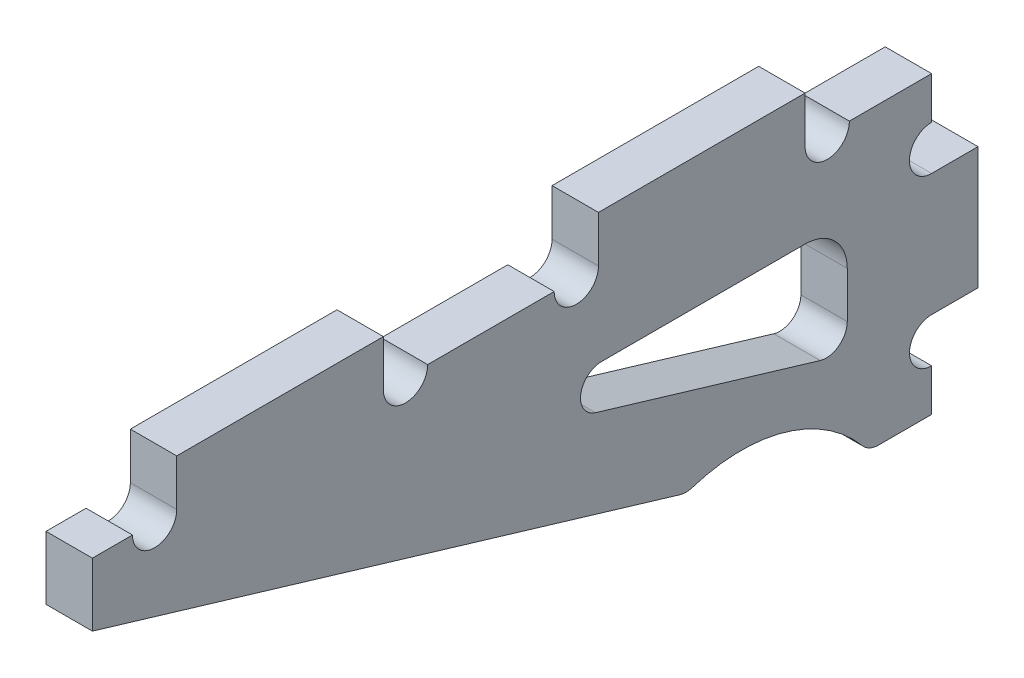
ISO-10303-21;
HEADER;
FILE_DESCRIPTION(('STEP AP214'),'2;1');
FILE_NAME('part.step','',(''),(''),'','','');
FILE_SCHEMA(('AUTOMOTIVE_DESIGN { 1 0 10303 214 1 1 1 1 }'));
ENDSEC;
DATA;
#1=APPLICATION_CONTEXT('core data for automotive mechanical design processes');
#2=APPLICATION_PROTOCOL_DEFINITION('international standard','automotive_design',2000,#1);
#3=PRODUCT_CONTEXT('',#1,'mechanical');
#4=PRODUCT('Part','Part','',(#3));
#5=PRODUCT_RELATED_PRODUCT_CATEGORY('part','',(#4));
#6=PRODUCT_DEFINITION_FORMATION('','',#4);
#7=PRODUCT_DEFINITION_CONTEXT('part definition',#1,'design');
#8=PRODUCT_DEFINITION('design','',#6,#7);
#9=PRODUCT_DEFINITION_SHAPE('','',#8);
#10=(LENGTH_UNIT() NAMED_UNIT(*) SI_UNIT(.MILLI.,.METRE.));
#11=(NAMED_UNIT(*) PLANE_ANGLE_UNIT() SI_UNIT($,.RADIAN.));
#12=(NAMED_UNIT(*) SI_UNIT($,.STERADIAN.) SOLID_ANGLE_UNIT());
#13=UNCERTAINTY_MEASURE_WITH_UNIT(LENGTH_MEASURE(1.E-05),#10,'distance_accuracy_value','');
#14=(GEOMETRIC_REPRESENTATION_CONTEXT(3) GLOBAL_UNCERTAINTY_ASSIGNED_CONTEXT((#13)) GLOBAL_UNIT_ASSIGNED_CONTEXT((#10,
#11,#12)) REPRESENTATION_CONTEXT('',''));
#15=CARTESIAN_POINT('',(0.,0.,0.));
#16=DIRECTION('',(0.,0.,1.));
#17=DIRECTION('',(1.,0.,0.));
#18=AXIS2_PLACEMENT_3D('',#15,#16,#17);
#19=CARTESIAN_POINT('',(2.2,0.,-6.9));
#20=DIRECTION('',(0.,0.,-1.));
#21=DIRECTION('',(-1.,0.,0.));
#22=AXIS2_PLACEMENT_3D('',#19,#20,#21);
#23=PLANE('',#22);
#24=DIRECTION('',(0.,-1.,0.));
#25=VECTOR('',#24,1.);
#26=CARTESIAN_POINT('',(0.,0.,-6.9));
#27=LINE('',#26,#25);
#28=CARTESIAN_POINT('',(0.,-7.1,-6.9));
#29=VERTEX_POINT('',#28);
#30=CARTESIAN_POINT('',(0.,-9.2835797355819,-6.9));
#31=VERTEX_POINT('',#30);
#32=EDGE_CURVE('E398',#29,#31,#27,.T.);
#33=ORIENTED_EDGE('',*,*,#32,.T.);
#34=DIRECTION('',(-1.,0.,0.));
#35=VECTOR('',#34,1.);
#36=CARTESIAN_POINT('',(2.2,-9.2835797355819,-6.9));
#37=LINE('',#36,#35);
#38=CARTESIAN_POINT('',(2.2,-9.2835797355819,-6.9));
#39=VERTEX_POINT('',#38);
#40=EDGE_CURVE('E481',#31,#39,#37,.F.);
#41=ORIENTED_EDGE('',*,*,#40,.T.);
#42=DIRECTION('',(0.,-1.,0.));
#43=VECTOR('',#42,1.);
#44=CARTESIAN_POINT('',(2.2,0.,-6.9));
#45=LINE('',#44,#43);
#46=CARTESIAN_POINT('',(2.2,-7.1,-6.9));
#47=VERTEX_POINT('',#46);
#48=EDGE_CURVE('E328',#47,#39,#45,.T.);
#49=ORIENTED_EDGE('',*,*,#48,.F.);
#50=DIRECTION('',(-1.,0.,0.));
#51=VECTOR('',#50,1.);
#52=CARTESIAN_POINT('',(0.,-7.1,-6.9));
#53=LINE('',#52,#51);
#54=EDGE_CURVE('E268',#47,#29,#53,.T.);
#55=ORIENTED_EDGE('',*,*,#54,.T.);
#56=EDGE_LOOP('',(#33,#41,#49,#55));
#57=FACE_BOUND('',#56,.T.);
#58=ADVANCED_FACE('F36',(#57),#23,.F.);
#59=CARTESIAN_POINT('',(2.2,-7.86131125572215,2.34984847317782));
#60=DIRECTION('',(0.,-0.958112439858677,0.286392305392539));
#61=DIRECTION('',(0.,-0.286392305392539,-0.958112439858677));
#62=AXIS2_PLACEMENT_3D('',#59,#60,#61);
#63=PLANE('',#62);
#64=DIRECTION('',(0.,0.286392305392539,0.958112439858677));
#65=VECTOR('',#64,1.);
#66=CARTESIAN_POINT('',(2.2,-7.86131125572215,2.34984847317782));
#67=LINE('',#66,#65);
#68=CARTESIAN_POINT('',(2.2,-10.2416921754406,-5.61360769460746));
#69=VERTEX_POINT('',#68);
#70=CARTESIAN_POINT('',(2.2,-7.05811243985868,5.03691360261197));
#71=VERTEX_POINT('',#70);
#72=EDGE_CURVE('E330',#69,#71,#67,.T.);
#73=ORIENTED_EDGE('',*,*,#72,.F.);
#74=DIRECTION('',(-1.,0.,0.));
#75=VECTOR('',#74,1.);
#76=CARTESIAN_POINT('',(0.,-10.2416921754406,-5.61360769460746));
#77=LINE('',#76,#75);
#78=CARTESIAN_POINT('',(0.,-10.2416921754406,-5.61360769460746));
#79=VERTEX_POINT('',#78);
#80=EDGE_CURVE('E478',#69,#79,#77,.T.);
#81=ORIENTED_EDGE('',*,*,#80,.T.);
#82=DIRECTION('',(0.,0.286392305392539,0.958112439858677));
#83=VECTOR('',#82,1.);
#84=CARTESIAN_POINT('',(0.,-7.86131125572215,2.34984847317782));
#85=LINE('',#84,#83);
#86=CARTESIAN_POINT('',(0.,-7.05811243985868,5.03691360261197));
#87=VERTEX_POINT('',#86);
#88=EDGE_CURVE('E401',#79,#87,#85,.T.);
#89=ORIENTED_EDGE('',*,*,#88,.T.);
#90=DIRECTION('',(-1.,0.,0.));
#91=VECTOR('',#90,1.);
#92=CARTESIAN_POINT('',(2.2,-7.05811243985868,5.03691360261197));
#93=LINE('',#92,#91);
#94=EDGE_CURVE('E51',#87,#71,#93,.F.);
#95=ORIENTED_EDGE('',*,*,#94,.T.);
#96=EDGE_LOOP('',(#73,#81,#89,#95));
#97=FACE_BOUND('',#96,.T.);
#98=ADVANCED_FACE('F495',(#97),#63,.F.);
#99=CARTESIAN_POINT('',(2.2,-19.5599092648856,-1.87014018828072));
#100=DIRECTION('',(-1.,0.,0.));
#101=DIRECTION('',(0.,0.,1.));
#102=AXIS2_PLACEMENT_3D('',#99,#100,#101);
#103=CYLINDRICAL_SURFACE('',#102,7.50000000000001);
#104=CARTESIAN_POINT('',(0.,-19.5599092648856,-1.87014018828072));
#105=DIRECTION('',(1.,0.,0.));
#106=DIRECTION('',(0.,0.,-1.));
#107=AXIS2_PLACEMENT_3D('',#104,#105,#106);
#108=CIRCLE('',#107,7.50000000000001);
#109=CARTESIAN_POINT('',(0.,-14.7423422664571,-7.61827451305538));
#110=VERTEX_POINT('',#109);
#111=CARTESIAN_POINT('',(0.,-12.4236850596521,0.43730517242417));
#112=VERTEX_POINT('',#111);
#113=EDGE_CURVE('E335',#110,#112,#108,.T.);
#114=ORIENTED_EDGE('',*,*,#113,.F.);
#115=DIRECTION('',(-1.,0.,0.));
#116=VECTOR('',#115,1.);
#117=CARTESIAN_POINT('',(2.2,-14.7423422664571,-7.61827451305539));
#118=LINE('',#117,#116);
#119=CARTESIAN_POINT('',(2.2,-14.7423422664571,-7.61827451305538));
#120=VERTEX_POINT('',#119);
#121=EDGE_CURVE('E470',#110,#120,#118,.F.);
#122=ORIENTED_EDGE('',*,*,#121,.T.);
#123=CARTESIAN_POINT('',(2.2,-19.5599092648856,-1.87014018828072));
#124=DIRECTION('',(1.,0.,0.));
#125=DIRECTION('',(0.,0.,-1.));
#126=AXIS2_PLACEMENT_3D('',#123,#124,#125);
#127=CIRCLE('',#126,7.50000000000001);
#128=CARTESIAN_POINT('',(2.2,-12.4236850596521,0.43730517242417));
#129=VERTEX_POINT('',#128);
#130=EDGE_CURVE('E258',#120,#129,#127,.T.);
#131=ORIENTED_EDGE('',*,*,#130,.T.);
#132=DIRECTION('',(-1.,0.,0.));
#133=VECTOR('',#132,1.);
#134=CARTESIAN_POINT('',(2.2,-12.4236850596521,0.437305172424171));
#135=LINE('',#134,#133);
#136=EDGE_CURVE('E467',#129,#112,#135,.T.);
#137=ORIENTED_EDGE('',*,*,#136,.T.);
#138=EDGE_LOOP('',(#114,#122,#131,#137));
#139=FACE_BOUND('',#138,.T.);
#140=ADVANCED_FACE('F525',(#139),#103,.F.);
#141=CARTESIAN_POINT('',(2.2,-15.1,0.));
#142=DIRECTION('',(0.,1.,0.));
#143=DIRECTION('',(0.,0.,1.));
#144=AXIS2_PLACEMENT_3D('',#141,#142,#143);
#145=PLANE('',#144);
#146=DIRECTION('',(0.,0.,-1.));
#147=VECTOR('',#146,1.);
#148=CARTESIAN_POINT('',(2.2,-15.1,0.));
#149=LINE('',#148,#147);
#150=CARTESIAN_POINT('',(2.2,-15.1,-8.38469242302534));
#151=VERTEX_POINT('',#150);
#152=CARTESIAN_POINT('',(2.2,-15.1,-10.9));
#153=VERTEX_POINT('',#152);
#154=EDGE_CURVE('E245',#151,#153,#149,.T.);
#155=ORIENTED_EDGE('',*,*,#154,.F.);
#156=DIRECTION('',(1.,0.,0.));
#157=VECTOR('',#156,1.);
#158=CARTESIAN_POINT('',(0.,-15.1,-8.38469242302534));
#159=LINE('',#158,#157);
#160=CARTESIAN_POINT('',(0.,-15.1,-8.38469242302534));
#161=VERTEX_POINT('',#160);
#162=EDGE_CURVE('E461',#151,#161,#159,.F.);
#163=ORIENTED_EDGE('',*,*,#162,.T.);
#164=DIRECTION('',(0.,0.,-1.));
#165=VECTOR('',#164,1.);
#166=CARTESIAN_POINT('',(0.,-15.1,0.));
#167=LINE('',#166,#165);
#168=CARTESIAN_POINT('',(0.,-15.1,-10.9));
#169=VERTEX_POINT('',#168);
#170=EDGE_CURVE('E264',#161,#169,#167,.T.);
#171=ORIENTED_EDGE('',*,*,#170,.T.);
#172=DIRECTION('',(-1.,0.,0.));
#173=VECTOR('',#172,1.);
#174=CARTESIAN_POINT('',(2.2,-15.1,-10.9));
#175=LINE('',#174,#173);
#176=EDGE_CURVE('E261',#153,#169,#175,.T.);
#177=ORIENTED_EDGE('',*,*,#176,.F.);
#178=EDGE_LOOP('',(#155,#163,#171,#177));
#179=FACE_BOUND('',#178,.T.);
#180=ADVANCED_FACE('F262',(#179),#145,.F.);
#181=CARTESIAN_POINT('',(2.2,0.,-10.9));
#182=DIRECTION('',(0.,0.,1.));
#183=DIRECTION('',(1.,0.,0.));
#184=AXIS2_PLACEMENT_3D('',#181,#182,#183);
#185=PLANE('',#184);
#186=DIRECTION('',(0.,1.,0.));
#187=VECTOR('',#186,1.);
#188=CARTESIAN_POINT('',(0.,0.,-10.9));
#189=LINE('',#188,#187);
#190=CARTESIAN_POINT('',(0.,-13.1,-10.9));
#191=VERTEX_POINT('',#190);
#192=EDGE_CURVE('E339',#169,#191,#189,.T.);
#193=ORIENTED_EDGE('',*,*,#192,.T.);
#194=DIRECTION('',(-1.,0.,0.));
#195=VECTOR('',#194,1.);
#196=CARTESIAN_POINT('',(2.2,-13.1,-10.9));
#197=LINE('',#196,#195);
#198=CARTESIAN_POINT('',(2.2,-13.1,-10.9));
#199=VERTEX_POINT('',#198);
#200=EDGE_CURVE('E269',#199,#191,#197,.T.);
#201=ORIENTED_EDGE('',*,*,#200,.F.);
#202=DIRECTION('',(0.,1.,0.));
#203=VECTOR('',#202,1.);
#204=CARTESIAN_POINT('',(2.2,0.,-10.9));
#205=LINE('',#204,#203);
#206=EDGE_CURVE('E251',#153,#199,#205,.T.);
#207=ORIENTED_EDGE('',*,*,#206,.F.);
#208=ORIENTED_EDGE('',*,*,#176,.T.);
#209=EDGE_LOOP('',(#193,#201,#207,#208));
#210=FACE_BOUND('',#209,.T.);
#211=ADVANCED_FACE('F271',(#210),#185,.F.);
#212=CARTESIAN_POINT('',(2.2,-12.05,-10.9));
#213=DIRECTION('',(-1.,0.,0.));
#214=DIRECTION('',(0.,0.,1.));
#215=AXIS2_PLACEMENT_3D('',#212,#213,#214);
#216=CYLINDRICAL_SURFACE('',#215,1.05);
#217=CARTESIAN_POINT('',(0.,-12.05,-10.9));
#218=DIRECTION('',(1.,0.,0.));
#219=DIRECTION('',(0.,0.,-1.));
#220=AXIS2_PLACEMENT_3D('',#217,#218,#219);
#221=CIRCLE('',#220,1.05);
#222=CARTESIAN_POINT('',(0.,-11.,-10.9));
#223=VERTEX_POINT('',#222);
#224=EDGE_CURVE('E341',#223,#191,#221,.T.);
#225=ORIENTED_EDGE('',*,*,#224,.F.);
#226=DIRECTION('',(-1.,0.,0.));
#227=VECTOR('',#226,1.);
#228=CARTESIAN_POINT('',(2.2,-11.,-10.9));
#229=LINE('',#228,#227);
#230=CARTESIAN_POINT('',(2.2,-11.,-10.9));
#231=VERTEX_POINT('',#230);
#232=EDGE_CURVE('E448',#231,#223,#229,.T.);
#233=ORIENTED_EDGE('',*,*,#232,.F.);
#234=CARTESIAN_POINT('',(2.2,-12.05,-10.9));
#235=DIRECTION('',(1.,0.,0.));
#236=DIRECTION('',(0.,0.,-1.));
#237=AXIS2_PLACEMENT_3D('',#234,#235,#236);
#238=CIRCLE('',#237,1.05);
#239=EDGE_CURVE('E273',#231,#199,#238,.T.);
#240=ORIENTED_EDGE('',*,*,#239,.T.);
#241=ORIENTED_EDGE('',*,*,#200,.T.);
#242=EDGE_LOOP('',(#225,#233,#240,#241));
#243=FACE_BOUND('',#242,.T.);
#244=ADVANCED_FACE('F608',(#243),#216,.F.);
#245=CARTESIAN_POINT('',(2.2,-11.,0.));
#246=DIRECTION('',(0.,-1.,0.));
#247=DIRECTION('',(0.,0.,-1.));
#248=AXIS2_PLACEMENT_3D('',#245,#246,#247);
#249=PLANE('',#248);
#250=DIRECTION('',(0.,0.,1.));
#251=VECTOR('',#250,1.);
#252=CARTESIAN_POINT('',(0.,-11.,0.));
#253=LINE('',#252,#251);
#254=CARTESIAN_POINT('',(0.,-11.,-13.1));
#255=VERTEX_POINT('',#254);
#256=EDGE_CURVE('E344',#255,#223,#253,.T.);
#257=ORIENTED_EDGE('',*,*,#256,.F.);
#258=DIRECTION('',(-1.,0.,0.));
#259=VECTOR('',#258,1.);
#260=CARTESIAN_POINT('',(2.2,-11.,-13.1));
#261=LINE('',#260,#259);
#262=CARTESIAN_POINT('',(2.2,-11.,-13.1));
#263=VERTEX_POINT('',#262);
#264=EDGE_CURVE('E446',#263,#255,#261,.T.);
#265=ORIENTED_EDGE('',*,*,#264,.F.);
#266=DIRECTION('',(0.,0.,1.));
#267=VECTOR('',#266,1.);
#268=CARTESIAN_POINT('',(2.2,-11.,0.));
#269=LINE('',#268,#267);
#270=EDGE_CURVE('E275',#263,#231,#269,.T.);
#271=ORIENTED_EDGE('',*,*,#270,.T.);
#272=ORIENTED_EDGE('',*,*,#232,.T.);
#273=EDGE_LOOP('',(#257,#265,#271,#272));
#274=FACE_BOUND('',#273,.T.);
#275=ADVANCED_FACE('F604',(#274),#249,.T.);
#276=CARTESIAN_POINT('',(2.2,0.,-13.1));
#277=DIRECTION('',(0.,0.,1.));
#278=DIRECTION('',(1.,0.,0.));
#279=AXIS2_PLACEMENT_3D('',#276,#277,#278);
#280=PLANE('',#279);
#281=DIRECTION('',(0.,1.,0.));
#282=VECTOR('',#281,1.);
#283=CARTESIAN_POINT('',(0.,0.,-13.1));
#284=LINE('',#283,#282);
#285=CARTESIAN_POINT('',(0.,-5.2,-13.1));
#286=VERTEX_POINT('',#285);
#287=EDGE_CURVE('E347',#255,#286,#284,.T.);
#288=ORIENTED_EDGE('',*,*,#287,.T.);
#289=DIRECTION('',(-1.,0.,0.));
#290=VECTOR('',#289,1.);
#291=CARTESIAN_POINT('',(2.2,-5.2,-13.1));
#292=LINE('',#291,#290);
#293=CARTESIAN_POINT('',(2.2,-5.2,-13.1));
#294=VERTEX_POINT('',#293);
#295=EDGE_CURVE('E443',#294,#286,#292,.T.);
#296=ORIENTED_EDGE('',*,*,#295,.F.);
#297=DIRECTION('',(0.,1.,0.));
#298=VECTOR('',#297,1.);
#299=CARTESIAN_POINT('',(2.2,0.,-13.1));
#300=LINE('',#299,#298);
#301=EDGE_CURVE('E281',#263,#294,#300,.T.);
#302=ORIENTED_EDGE('',*,*,#301,.F.);
#303=ORIENTED_EDGE('',*,*,#264,.T.);
#304=EDGE_LOOP('',(#288,#296,#302,#303));
#305=FACE_BOUND('',#304,.T.);
#306=ADVANCED_FACE('F600',(#305),#280,.F.);
#307=CARTESIAN_POINT('',(2.2,-5.2,0.));
#308=DIRECTION('',(0.,-1.,0.));
#309=DIRECTION('',(0.,0.,-1.));
#310=AXIS2_PLACEMENT_3D('',#307,#308,#309);
#311=PLANE('',#310);
#312=DIRECTION('',(0.,0.,1.));
#313=VECTOR('',#312,1.);
#314=CARTESIAN_POINT('',(0.,-5.2,0.));
#315=LINE('',#314,#313);
#316=CARTESIAN_POINT('',(0.,-5.2,-10.9));
#317=VERTEX_POINT('',#316);
#318=EDGE_CURVE('E349',#286,#317,#315,.T.);
#319=ORIENTED_EDGE('',*,*,#318,.T.);
#320=DIRECTION('',(-1.,0.,0.));
#321=VECTOR('',#320,1.);
#322=CARTESIAN_POINT('',(2.2,-5.2,-10.9));
#323=LINE('',#322,#321);
#324=CARTESIAN_POINT('',(2.2,-5.2,-10.9));
#325=VERTEX_POINT('',#324);
#326=EDGE_CURVE('E441',#325,#317,#323,.T.);
#327=ORIENTED_EDGE('',*,*,#326,.F.);
#328=DIRECTION('',(0.,0.,1.));
#329=VECTOR('',#328,1.);
#330=CARTESIAN_POINT('',(2.2,-5.2,0.));
#331=LINE('',#330,#329);
#332=EDGE_CURVE('E283',#294,#325,#331,.T.);
#333=ORIENTED_EDGE('',*,*,#332,.F.);
#334=ORIENTED_EDGE('',*,*,#295,.T.);
#335=EDGE_LOOP('',(#319,#327,#333,#334));
#336=FACE_BOUND('',#335,.T.);
#337=ADVANCED_FACE('F596',(#336),#311,.F.);
#338=CARTESIAN_POINT('',(2.2,-4.15,-10.9));
#339=DIRECTION('',(-1.,0.,0.));
#340=DIRECTION('',(0.,0.,1.));
#341=AXIS2_PLACEMENT_3D('',#338,#339,#340);
#342=CYLINDRICAL_SURFACE('',#341,1.05);
#343=CARTESIAN_POINT('',(0.,-4.15,-10.9));
#344=DIRECTION('',(1.,0.,0.));
#345=DIRECTION('',(0.,0.,-1.));
#346=AXIS2_PLACEMENT_3D('',#343,#344,#345);
#347=CIRCLE('',#346,1.05);
#348=CARTESIAN_POINT('',(0.,-3.1,-10.9));
#349=VERTEX_POINT('',#348);
#350=EDGE_CURVE('E352',#349,#317,#347,.T.);
#351=ORIENTED_EDGE('',*,*,#350,.F.);
#352=DIRECTION('',(-1.,0.,0.));
#353=VECTOR('',#352,1.);
#354=CARTESIAN_POINT('',(2.2,-3.1,-10.9));
#355=LINE('',#354,#353);
#356=CARTESIAN_POINT('',(2.2,-3.1,-10.9));
#357=VERTEX_POINT('',#356);
#358=EDGE_CURVE('E439',#357,#349,#355,.T.);
#359=ORIENTED_EDGE('',*,*,#358,.F.);
#360=CARTESIAN_POINT('',(2.2,-4.15,-10.9));
#361=DIRECTION('',(1.,0.,0.));
#362=DIRECTION('',(0.,0.,-1.));
#363=AXIS2_PLACEMENT_3D('',#360,#361,#362);
#364=CIRCLE('',#363,1.05);
#365=EDGE_CURVE('E285',#357,#325,#364,.T.);
#366=ORIENTED_EDGE('',*,*,#365,.T.);
#367=ORIENTED_EDGE('',*,*,#326,.T.);
#368=EDGE_LOOP('',(#351,#359,#366,#367));
#369=FACE_BOUND('',#368,.T.);
#370=ADVANCED_FACE('F592',(#369),#342,.F.);
#371=CARTESIAN_POINT('',(2.2,0.,-10.9));
#372=DIRECTION('',(0.,0.,-1.));
#373=DIRECTION('',(-1.,0.,0.));
#374=AXIS2_PLACEMENT_3D('',#371,#372,#373);
#375=PLANE('',#374);
#376=DIRECTION('',(0.,-1.,0.));
#377=VECTOR('',#376,1.);
#378=CARTESIAN_POINT('',(0.,0.,-10.9));
#379=LINE('',#378,#377);
#380=CARTESIAN_POINT('',(0.,-1.1,-10.9));
#381=VERTEX_POINT('',#380);
#382=EDGE_CURVE('E355',#381,#349,#379,.T.);
#383=ORIENTED_EDGE('',*,*,#382,.F.);
#384=DIRECTION('',(-1.,0.,0.));
#385=VECTOR('',#384,1.);
#386=CARTESIAN_POINT('',(2.2,-1.1,-10.9));
#387=LINE('',#386,#385);
#388=CARTESIAN_POINT('',(2.2,-1.1,-10.9));
#389=VERTEX_POINT('',#388);
#390=EDGE_CURVE('E437',#389,#381,#387,.T.);
#391=ORIENTED_EDGE('',*,*,#390,.F.);
#392=DIRECTION('',(0.,-1.,0.));
#393=VECTOR('',#392,1.);
#394=CARTESIAN_POINT('',(2.2,0.,-10.9));
#395=LINE('',#394,#393);
#396=EDGE_CURVE('E288',#389,#357,#395,.T.);
#397=ORIENTED_EDGE('',*,*,#396,.T.);
#398=ORIENTED_EDGE('',*,*,#358,.T.);
#399=EDGE_LOOP('',(#383,#391,#397,#398));
#400=FACE_BOUND('',#399,.T.);
#401=ADVANCED_FACE('F588',(#400),#375,.T.);
#402=CARTESIAN_POINT('',(2.2,-1.1,0.));
#403=DIRECTION('',(0.,1.,0.));
#404=DIRECTION('',(0.,0.,1.));
#405=AXIS2_PLACEMENT_3D('',#402,#403,#404);
#406=PLANE('',#405);
#407=DIRECTION('',(0.,0.,-1.));
#408=VECTOR('',#407,1.);
#409=CARTESIAN_POINT('',(0.,-1.1,0.));
#410=LINE('',#409,#408);
#411=CARTESIAN_POINT('',(0.,-1.1,-7.));
#412=VERTEX_POINT('',#411);
#413=EDGE_CURVE('E358',#412,#381,#410,.T.);
#414=ORIENTED_EDGE('',*,*,#413,.F.);
#415=DIRECTION('',(-1.,0.,0.));
#416=VECTOR('',#415,1.);
#417=CARTESIAN_POINT('',(2.2,-1.1,-7.));
#418=LINE('',#417,#416);
#419=CARTESIAN_POINT('',(2.2,-1.1,-7.));
#420=VERTEX_POINT('',#419);
#421=EDGE_CURVE('E435',#420,#412,#418,.T.);
#422=ORIENTED_EDGE('',*,*,#421,.F.);
#423=DIRECTION('',(0.,0.,-1.));
#424=VECTOR('',#423,1.);
#425=CARTESIAN_POINT('',(2.2,-1.1,0.));
#426=LINE('',#425,#424);
#427=EDGE_CURVE('E291',#420,#389,#426,.T.);
#428=ORIENTED_EDGE('',*,*,#427,.T.);
#429=ORIENTED_EDGE('',*,*,#390,.T.);
#430=EDGE_LOOP('',(#414,#422,#428,#429));
#431=FACE_BOUND('',#430,.T.);
#432=ADVANCED_FACE('F584',(#431),#406,.T.);
#433=CARTESIAN_POINT('',(2.2,-1.1,-5.95));
#434=DIRECTION('',(-1.,0.,0.));
#435=DIRECTION('',(0.,0.,1.));
#436=AXIS2_PLACEMENT_3D('',#433,#434,#435);
#437=CYLINDRICAL_SURFACE('',#436,1.05);
#438=CARTESIAN_POINT('',(0.,-1.1,-5.95));
#439=DIRECTION('',(1.,0.,0.));
#440=DIRECTION('',(0.,0.,-1.));
#441=AXIS2_PLACEMENT_3D('',#438,#439,#440);
#442=CIRCLE('',#441,1.05);
#443=CARTESIAN_POINT('',(0.,-1.1,-4.9));
#444=VERTEX_POINT('',#443);
#445=EDGE_CURVE('E361',#444,#412,#442,.T.);
#446=ORIENTED_EDGE('',*,*,#445,.F.);
#447=DIRECTION('',(-1.,0.,0.));
#448=VECTOR('',#447,1.);
#449=CARTESIAN_POINT('',(2.2,-1.1,-4.9));
#450=LINE('',#449,#448);
#451=CARTESIAN_POINT('',(2.2,-1.1,-4.9));
#452=VERTEX_POINT('',#451);
#453=EDGE_CURVE('E433',#452,#444,#450,.T.);
#454=ORIENTED_EDGE('',*,*,#453,.F.);
#455=CARTESIAN_POINT('',(2.2,-1.1,-5.95));
#456=DIRECTION('',(1.,0.,0.));
#457=DIRECTION('',(0.,0.,-1.));
#458=AXIS2_PLACEMENT_3D('',#455,#456,#457);
#459=CIRCLE('',#458,1.05);
#460=EDGE_CURVE('E294',#452,#420,#459,.T.);
#461=ORIENTED_EDGE('',*,*,#460,.T.);
#462=ORIENTED_EDGE('',*,*,#421,.T.);
#463=EDGE_LOOP('',(#446,#454,#461,#462));
#464=FACE_BOUND('',#463,.T.);
#465=ADVANCED_FACE('F580',(#464),#437,.F.);
#466=CARTESIAN_POINT('',(2.2,0.,-4.9));
#467=DIRECTION('',(0.,0.,1.));
#468=DIRECTION('',(1.,0.,0.));
#469=AXIS2_PLACEMENT_3D('',#466,#467,#468);
#470=PLANE('',#469);
#471=DIRECTION('',(0.,1.,0.));
#472=VECTOR('',#471,1.);
#473=CARTESIAN_POINT('',(0.,0.,-4.9));
#474=LINE('',#473,#472);
#475=CARTESIAN_POINT('',(0.,1.1,-4.9));
#476=VERTEX_POINT('',#475);
#477=EDGE_CURVE('E364',#444,#476,#474,.T.);
#478=ORIENTED_EDGE('',*,*,#477,.T.);
#479=DIRECTION('',(-1.,0.,0.));
#480=VECTOR('',#479,1.);
#481=CARTESIAN_POINT('',(2.2,1.1,-4.9));
#482=LINE('',#481,#480);
#483=CARTESIAN_POINT('',(2.2,1.1,-4.9));
#484=VERTEX_POINT('',#483);
#485=EDGE_CURVE('E430',#484,#476,#482,.T.);
#486=ORIENTED_EDGE('',*,*,#485,.F.);
#487=DIRECTION('',(0.,1.,0.));
#488=VECTOR('',#487,1.);
#489=CARTESIAN_POINT('',(2.2,0.,-4.9));
#490=LINE('',#489,#488);
#491=EDGE_CURVE('E297',#452,#484,#490,.T.);
#492=ORIENTED_EDGE('',*,*,#491,.F.);
#493=ORIENTED_EDGE('',*,*,#453,.T.);
#494=EDGE_LOOP('',(#478,#486,#492,#493));
#495=FACE_BOUND('',#494,.T.);
#496=ADVANCED_FACE('F576',(#495),#470,.F.);
#497=CARTESIAN_POINT('',(2.2,1.1,0.));
#498=DIRECTION('',(0.,-1.,0.));
#499=DIRECTION('',(0.,0.,-1.));
#500=AXIS2_PLACEMENT_3D('',#497,#498,#499);
#501=PLANE('',#500);
#502=DIRECTION('',(0.,0.,1.));
#503=VECTOR('',#502,1.);
#504=CARTESIAN_POINT('',(0.,1.1,0.));
#505=LINE('',#504,#503);
#506=CARTESIAN_POINT('',(0.,1.1,4.9));
#507=VERTEX_POINT('',#506);
#508=EDGE_CURVE('E366',#476,#507,#505,.T.);
#509=ORIENTED_EDGE('',*,*,#508,.T.);
#510=DIRECTION('',(-1.,0.,0.));
#511=VECTOR('',#510,1.);
#512=CARTESIAN_POINT('',(2.2,1.1,4.9));
#513=LINE('',#512,#511);
#514=CARTESIAN_POINT('',(2.2,1.1,4.9));
#515=VERTEX_POINT('',#514);
#516=EDGE_CURVE('E428',#515,#507,#513,.T.);
#517=ORIENTED_EDGE('',*,*,#516,.F.);
#518=DIRECTION('',(0.,0.,1.));
#519=VECTOR('',#518,1.);
#520=CARTESIAN_POINT('',(2.2,1.1,0.));
#521=LINE('',#520,#519);
#522=EDGE_CURVE('E299',#484,#515,#521,.T.);
#523=ORIENTED_EDGE('',*,*,#522,.F.);
#524=ORIENTED_EDGE('',*,*,#485,.T.);
#525=EDGE_LOOP('',(#509,#517,#523,#524));
#526=FACE_BOUND('',#525,.T.);
#527=ADVANCED_FACE('F572',(#526),#501,.F.);
#528=CARTESIAN_POINT('',(2.2,0.,4.9));
#529=DIRECTION('',(0.,0.,1.));
#530=DIRECTION('',(1.,0.,0.));
#531=AXIS2_PLACEMENT_3D('',#528,#529,#530);
#532=PLANE('',#531);
#533=DIRECTION('',(0.,1.,0.));
#534=VECTOR('',#533,1.);
#535=CARTESIAN_POINT('',(0.,0.,4.9));
#536=LINE('',#535,#534);
#537=CARTESIAN_POINT('',(0.,-1.1,4.9));
#538=VERTEX_POINT('',#537);
#539=EDGE_CURVE('E369',#538,#507,#536,.T.);
#540=ORIENTED_EDGE('',*,*,#539,.F.);
#541=DIRECTION('',(-1.,0.,0.));
#542=VECTOR('',#541,1.);
#543=CARTESIAN_POINT('',(2.2,-1.1,4.9));
#544=LINE('',#543,#542);
#545=CARTESIAN_POINT('',(2.2,-1.1,4.9));
#546=VERTEX_POINT('',#545);
#547=EDGE_CURVE('E426',#546,#538,#544,.T.);
#548=ORIENTED_EDGE('',*,*,#547,.F.);
#549=DIRECTION('',(0.,1.,0.));
#550=VECTOR('',#549,1.);
#551=CARTESIAN_POINT('',(2.2,0.,4.9));
#552=LINE('',#551,#550);
#553=EDGE_CURVE('E301',#546,#515,#552,.T.);
#554=ORIENTED_EDGE('',*,*,#553,.T.);
#555=ORIENTED_EDGE('',*,*,#516,.T.);
#556=EDGE_LOOP('',(#540,#548,#554,#555));
#557=FACE_BOUND('',#556,.T.);
#558=ADVANCED_FACE('F568',(#557),#532,.T.);
#559=CARTESIAN_POINT('',(2.2,-1.1,5.95));
#560=DIRECTION('',(-1.,0.,0.));
#561=DIRECTION('',(0.,0.,1.));
#562=AXIS2_PLACEMENT_3D('',#559,#560,#561);
#563=CYLINDRICAL_SURFACE('',#562,1.05);
#564=CARTESIAN_POINT('',(0.,-1.1,5.95));
#565=DIRECTION('',(1.,0.,0.));
#566=DIRECTION('',(0.,0.,-1.));
#567=AXIS2_PLACEMENT_3D('',#564,#565,#566);
#568=CIRCLE('',#567,1.05);
#569=CARTESIAN_POINT('',(0.,-1.1,7.));
#570=VERTEX_POINT('',#569);
#571=EDGE_CURVE('E372',#570,#538,#568,.T.);
#572=ORIENTED_EDGE('',*,*,#571,.F.);
#573=DIRECTION('',(-1.,0.,0.));
#574=VECTOR('',#573,1.);
#575=CARTESIAN_POINT('',(2.2,-1.1,7.));
#576=LINE('',#575,#574);
#577=CARTESIAN_POINT('',(2.2,-1.1,7.));
#578=VERTEX_POINT('',#577);
#579=EDGE_CURVE('E424',#578,#570,#576,.T.);
#580=ORIENTED_EDGE('',*,*,#579,.F.);
#581=CARTESIAN_POINT('',(2.2,-1.1,5.95));
#582=DIRECTION('',(1.,0.,0.));
#583=DIRECTION('',(0.,0.,-1.));
#584=AXIS2_PLACEMENT_3D('',#581,#582,#583);
#585=CIRCLE('',#584,1.05);
#586=EDGE_CURVE('E304',#578,#546,#585,.T.);
#587=ORIENTED_EDGE('',*,*,#586,.T.);
#588=ORIENTED_EDGE('',*,*,#547,.T.);
#589=EDGE_LOOP('',(#572,#580,#587,#588));
#590=FACE_BOUND('',#589,.T.);
#591=ADVANCED_FACE('F564',(#590),#563,.F.);
#592=CARTESIAN_POINT('',(2.2,-1.1,0.));
#593=DIRECTION('',(0.,-1.,0.));
#594=DIRECTION('',(0.,0.,-1.));
#595=AXIS2_PLACEMENT_3D('',#592,#593,#594);
#596=PLANE('',#595);
#597=DIRECTION('',(0.,0.,1.));
#598=VECTOR('',#597,1.);
#599=CARTESIAN_POINT('',(0.,-1.1,0.));
#600=LINE('',#599,#598);
#601=CARTESIAN_POINT('',(0.,-1.1,13.));
#602=VERTEX_POINT('',#601);
#603=EDGE_CURVE('E375',#570,#602,#600,.T.);
#604=ORIENTED_EDGE('',*,*,#603,.T.);
#605=DIRECTION('',(-1.,0.,0.));
#606=VECTOR('',#605,1.);
#607=CARTESIAN_POINT('',(2.2,-1.1,13.));
#608=LINE('',#607,#606);
#609=CARTESIAN_POINT('',(2.2,-1.1,13.));
#610=VERTEX_POINT('',#609);
#611=EDGE_CURVE('E422',#610,#602,#608,.T.);
#612=ORIENTED_EDGE('',*,*,#611,.F.);
#613=DIRECTION('',(0.,0.,1.));
#614=VECTOR('',#613,1.);
#615=CARTESIAN_POINT('',(2.2,-1.1,0.));
#616=LINE('',#615,#614);
#617=EDGE_CURVE('E307',#578,#610,#616,.T.);
#618=ORIENTED_EDGE('',*,*,#617,.F.);
#619=ORIENTED_EDGE('',*,*,#579,.T.);
#620=EDGE_LOOP('',(#604,#612,#618,#619));
#621=FACE_BOUND('',#620,.T.);
#622=ADVANCED_FACE('F560',(#621),#596,.F.);
#623=CARTESIAN_POINT('',(2.2,-1.1,14.05));
#624=DIRECTION('',(-1.,0.,0.));
#625=DIRECTION('',(0.,0.,1.));
#626=AXIS2_PLACEMENT_3D('',#623,#624,#625);
#627=CYLINDRICAL_SURFACE('',#626,1.05);
#628=CARTESIAN_POINT('',(0.,-1.1,14.05));
#629=DIRECTION('',(1.,0.,0.));
#630=DIRECTION('',(0.,0.,-1.));
#631=AXIS2_PLACEMENT_3D('',#628,#629,#630);
#632=CIRCLE('',#631,1.05);
#633=CARTESIAN_POINT('',(0.,-1.1,15.1));
#634=VERTEX_POINT('',#633);
#635=EDGE_CURVE('E378',#634,#602,#632,.T.);
#636=ORIENTED_EDGE('',*,*,#635,.F.);
#637=DIRECTION('',(-1.,0.,0.));
#638=VECTOR('',#637,1.);
#639=CARTESIAN_POINT('',(2.2,-1.1,15.1));
#640=LINE('',#639,#638);
#641=CARTESIAN_POINT('',(2.2,-1.1,15.1));
#642=VERTEX_POINT('',#641);
#643=EDGE_CURVE('E420',#642,#634,#640,.T.);
#644=ORIENTED_EDGE('',*,*,#643,.F.);
#645=CARTESIAN_POINT('',(2.2,-1.1,14.05));
#646=DIRECTION('',(1.,0.,0.));
#647=DIRECTION('',(0.,0.,-1.));
#648=AXIS2_PLACEMENT_3D('',#645,#646,#647);
#649=CIRCLE('',#648,1.05);
#650=EDGE_CURVE('E309',#642,#610,#649,.T.);
#651=ORIENTED_EDGE('',*,*,#650,.T.);
#652=ORIENTED_EDGE('',*,*,#611,.T.);
#653=EDGE_LOOP('',(#636,#644,#651,#652));
#654=FACE_BOUND('',#653,.T.);
#655=ADVANCED_FACE('F556',(#654),#627,.F.);
#656=CARTESIAN_POINT('',(2.2,0.,15.1));
#657=DIRECTION('',(0.,0.,1.));
#658=DIRECTION('',(1.,0.,0.));
#659=AXIS2_PLACEMENT_3D('',#656,#657,#658);
#660=PLANE('',#659);
#661=DIRECTION('',(0.,1.,0.));
#662=VECTOR('',#661,1.);
#663=CARTESIAN_POINT('',(0.,0.,15.1));
#664=LINE('',#663,#662);
#665=CARTESIAN_POINT('',(0.,1.1,15.1));
#666=VERTEX_POINT('',#665);
#667=EDGE_CURVE('E381',#634,#666,#664,.T.);
#668=ORIENTED_EDGE('',*,*,#667,.T.);
#669=DIRECTION('',(-1.,0.,0.));
#670=VECTOR('',#669,1.);
#671=CARTESIAN_POINT('',(2.2,1.1,15.1));
#672=LINE('',#671,#670);
#673=CARTESIAN_POINT('',(2.2,1.1,15.1));
#674=VERTEX_POINT('',#673);
#675=EDGE_CURVE('E417',#674,#666,#672,.T.);
#676=ORIENTED_EDGE('',*,*,#675,.F.);
#677=DIRECTION('',(0.,1.,0.));
#678=VECTOR('',#677,1.);
#679=CARTESIAN_POINT('',(2.2,0.,15.1));
#680=LINE('',#679,#678);
#681=EDGE_CURVE('E312',#642,#674,#680,.T.);
#682=ORIENTED_EDGE('',*,*,#681,.F.);
#683=ORIENTED_EDGE('',*,*,#643,.T.);
#684=EDGE_LOOP('',(#668,#676,#682,#683));
#685=FACE_BOUND('',#684,.T.);
#686=ADVANCED_FACE('F552',(#685),#660,.F.);
#687=CARTESIAN_POINT('',(2.2,1.1,0.));
#688=DIRECTION('',(0.,-1.,0.));
#689=DIRECTION('',(0.,0.,-1.));
#690=AXIS2_PLACEMENT_3D('',#687,#688,#689);
#691=PLANE('',#690);
#692=DIRECTION('',(0.,0.,1.));
#693=VECTOR('',#692,1.);
#694=CARTESIAN_POINT('',(0.,1.1,0.));
#695=LINE('',#694,#693);
#696=CARTESIAN_POINT('',(0.,1.1,24.9));
#697=VERTEX_POINT('',#696);
#698=EDGE_CURVE('E383',#666,#697,#695,.T.);
#699=ORIENTED_EDGE('',*,*,#698,.T.);
#700=DIRECTION('',(-1.,0.,0.));
#701=VECTOR('',#700,1.);
#702=CARTESIAN_POINT('',(2.2,1.1,24.9));
#703=LINE('',#702,#701);
#704=CARTESIAN_POINT('',(2.2,1.1,24.9));
#705=VERTEX_POINT('',#704);
#706=EDGE_CURVE('E414',#705,#697,#703,.T.);
#707=ORIENTED_EDGE('',*,*,#706,.F.);
#708=DIRECTION('',(0.,0.,1.));
#709=VECTOR('',#708,1.);
#710=CARTESIAN_POINT('',(2.2,1.1,0.));
#711=LINE('',#710,#709);
#712=EDGE_CURVE('E314',#674,#705,#711,.T.);
#713=ORIENTED_EDGE('',*,*,#712,.F.);
#714=ORIENTED_EDGE('',*,*,#675,.T.);
#715=EDGE_LOOP('',(#699,#707,#713,#714));
#716=FACE_BOUND('',#715,.T.);
#717=ADVANCED_FACE('F548',(#716),#691,.F.);
#718=CARTESIAN_POINT('',(2.2,0.,24.9));
#719=DIRECTION('',(0.,0.,-1.));
#720=DIRECTION('',(-1.,0.,0.));
#721=AXIS2_PLACEMENT_3D('',#718,#719,#720);
#722=PLANE('',#721);
#723=DIRECTION('',(0.,-1.,0.));
#724=VECTOR('',#723,1.);
#725=CARTESIAN_POINT('',(0.,0.,24.9));
#726=LINE('',#725,#724);
#727=CARTESIAN_POINT('',(0.,-1.1,24.9));
#728=VERTEX_POINT('',#727);
#729=EDGE_CURVE('E385',#697,#728,#726,.T.);
#730=ORIENTED_EDGE('',*,*,#729,.T.);
#731=DIRECTION('',(-1.,0.,0.));
#732=VECTOR('',#731,1.);
#733=CARTESIAN_POINT('',(2.2,-1.1,24.9));
#734=LINE('',#733,#732);
#735=CARTESIAN_POINT('',(2.2,-1.1,24.9));
#736=VERTEX_POINT('',#735);
#737=EDGE_CURVE('E412',#736,#728,#734,.T.);
#738=ORIENTED_EDGE('',*,*,#737,.F.);
#739=DIRECTION('',(0.,-1.,0.));
#740=VECTOR('',#739,1.);
#741=CARTESIAN_POINT('',(2.2,0.,24.9));
#742=LINE('',#741,#740);
#743=EDGE_CURVE('E316',#705,#736,#742,.T.);
#744=ORIENTED_EDGE('',*,*,#743,.F.);
#745=ORIENTED_EDGE('',*,*,#706,.T.);
#746=EDGE_LOOP('',(#730,#738,#744,#745));
#747=FACE_BOUND('',#746,.T.);
#748=ADVANCED_FACE('F544',(#747),#722,.F.);
#749=CARTESIAN_POINT('',(2.2,-1.1,25.95));
#750=DIRECTION('',(-1.,0.,0.));
#751=DIRECTION('',(0.,0.,1.));
#752=AXIS2_PLACEMENT_3D('',#749,#750,#751);
#753=CYLINDRICAL_SURFACE('',#752,1.05);
#754=CARTESIAN_POINT('',(0.,-1.1,25.95));
#755=DIRECTION('',(1.,0.,0.));
#756=DIRECTION('',(0.,0.,-1.));
#757=AXIS2_PLACEMENT_3D('',#754,#755,#756);
#758=CIRCLE('',#757,1.05);
#759=CARTESIAN_POINT('',(0.,-1.1,27.));
#760=VERTEX_POINT('',#759);
#761=EDGE_CURVE('E388',#760,#728,#758,.T.);
#762=ORIENTED_EDGE('',*,*,#761,.F.);
#763=DIRECTION('',(-1.,0.,0.));
#764=VECTOR('',#763,1.);
#765=CARTESIAN_POINT('',(2.2,-1.1,27.));
#766=LINE('',#765,#764);
#767=CARTESIAN_POINT('',(2.2,-1.1,27.));
#768=VERTEX_POINT('',#767);
#769=EDGE_CURVE('E410',#768,#760,#766,.T.);
#770=ORIENTED_EDGE('',*,*,#769,.F.);
#771=CARTESIAN_POINT('',(2.2,-1.1,25.95));
#772=DIRECTION('',(1.,0.,0.));
#773=DIRECTION('',(0.,0.,-1.));
#774=AXIS2_PLACEMENT_3D('',#771,#772,#773);
#775=CIRCLE('',#774,1.05);
#776=EDGE_CURVE('E318',#768,#736,#775,.T.);
#777=ORIENTED_EDGE('',*,*,#776,.T.);
#778=ORIENTED_EDGE('',*,*,#737,.T.);
#779=EDGE_LOOP('',(#762,#770,#777,#778));
#780=FACE_BOUND('',#779,.T.);
#781=ADVANCED_FACE('F540',(#780),#753,.F.);
#782=CARTESIAN_POINT('',(2.2,-1.1,0.));
#783=DIRECTION('',(0.,-1.,0.));
#784=DIRECTION('',(0.,0.,-1.));
#785=AXIS2_PLACEMENT_3D('',#782,#783,#784);
#786=PLANE('',#785);
#787=DIRECTION('',(0.,0.,1.));
#788=VECTOR('',#787,1.);
#789=CARTESIAN_POINT('',(0.,-1.1,0.));
#790=LINE('',#789,#788);
#791=CARTESIAN_POINT('',(0.,-1.1,28.9));
#792=VERTEX_POINT('',#791);
#793=EDGE_CURVE('E391',#760,#792,#790,.T.);
#794=ORIENTED_EDGE('',*,*,#793,.T.);
#795=DIRECTION('',(-1.,0.,0.));
#796=VECTOR('',#795,1.);
#797=CARTESIAN_POINT('',(2.2,-1.1,28.9));
#798=LINE('',#797,#796);
#799=CARTESIAN_POINT('',(2.2,-1.1,28.9));
#800=VERTEX_POINT('',#799);
#801=EDGE_CURVE('E407',#800,#792,#798,.T.);
#802=ORIENTED_EDGE('',*,*,#801,.F.);
#803=DIRECTION('',(0.,0.,1.));
#804=VECTOR('',#803,1.);
#805=CARTESIAN_POINT('',(2.2,-1.1,0.));
#806=LINE('',#805,#804);
#807=EDGE_CURVE('E321',#768,#800,#806,.T.);
#808=ORIENTED_EDGE('',*,*,#807,.F.);
#809=ORIENTED_EDGE('',*,*,#769,.T.);
#810=EDGE_LOOP('',(#794,#802,#808,#809));
#811=FACE_BOUND('',#810,.T.);
#812=ADVANCED_FACE('F536',(#811),#786,.F.);
#813=CARTESIAN_POINT('',(2.2,0.,28.9));
#814=DIRECTION('',(0.,0.,-1.));
#815=DIRECTION('',(-1.,0.,0.));
#816=AXIS2_PLACEMENT_3D('',#813,#814,#815);
#817=PLANE('',#816);
#818=DIRECTION('',(0.,-1.,0.));
#819=VECTOR('',#818,1.);
#820=CARTESIAN_POINT('',(0.,0.,28.9));
#821=LINE('',#820,#819);
#822=CARTESIAN_POINT('',(0.,-4.1,28.9));
#823=VERTEX_POINT('',#822);
#824=EDGE_CURVE('E393',#792,#823,#821,.T.);
#825=ORIENTED_EDGE('',*,*,#824,.T.);
#826=DIRECTION('',(-1.,0.,0.));
#827=VECTOR('',#826,1.);
#828=CARTESIAN_POINT('',(2.2,-4.1,28.9));
#829=LINE('',#828,#827);
#830=CARTESIAN_POINT('',(2.2,-4.1,28.9));
#831=VERTEX_POINT('',#830);
#832=EDGE_CURVE('E334',#831,#823,#829,.T.);
#833=ORIENTED_EDGE('',*,*,#832,.F.);
#834=DIRECTION('',(0.,-1.,0.));
#835=VECTOR('',#834,1.);
#836=CARTESIAN_POINT('',(2.2,0.,28.9));
#837=LINE('',#836,#835);
#838=EDGE_CURVE('E323',#800,#831,#837,.T.);
#839=ORIENTED_EDGE('',*,*,#838,.F.);
#840=ORIENTED_EDGE('',*,*,#801,.T.);
#841=EDGE_LOOP('',(#825,#833,#839,#840));
#842=FACE_BOUND('',#841,.T.);
#843=ADVANCED_FACE('F532',(#842),#817,.F.);
#844=CARTESIAN_POINT('',(2.2,-11.6937610151569,3.49541769474797));
#845=DIRECTION('',(0.,0.958112439858677,-0.286392305392539));
#846=DIRECTION('',(0.,0.286392305392539,0.958112439858677));
#847=AXIS2_PLACEMENT_3D('',#844,#845,#846);
#848=PLANE('',#847);
#849=DIRECTION('',(0.,-0.286392305392539,-0.958112439858677));
#850=VECTOR('',#849,1.);
#851=CARTESIAN_POINT('',(0.,-11.6937610151569,3.49541769474797));
#852=LINE('',#851,#850);
#853=CARTESIAN_POINT('',(0.,-12.4303009388129,1.03135685924403));
#854=VERTEX_POINT('',#853);
#855=EDGE_CURVE('E395',#823,#854,#852,.T.);
#856=ORIENTED_EDGE('',*,*,#855,.T.);
#857=DIRECTION('',(1.,0.,0.));
#858=VECTOR('',#857,1.);
#859=CARTESIAN_POINT('',(2.2,-12.4303009388129,1.03135685924403));
#860=LINE('',#859,#858);
#861=CARTESIAN_POINT('',(2.2,-12.4303009388129,1.03135685924403));
#862=VERTEX_POINT('',#861);
#863=EDGE_CURVE('E475',#854,#862,#860,.T.);
#864=ORIENTED_EDGE('',*,*,#863,.T.);
#865=DIRECTION('',(0.,-0.286392305392539,-0.958112439858677));
#866=VECTOR('',#865,1.);
#867=CARTESIAN_POINT('',(2.2,-11.6937610151569,3.49541769474797));
#868=LINE('',#867,#866);
#869=EDGE_CURVE('E325',#831,#862,#868,.T.);
#870=ORIENTED_EDGE('',*,*,#869,.F.);
#871=ORIENTED_EDGE('',*,*,#832,.T.);
#872=EDGE_LOOP('',(#856,#864,#870,#871));
#873=FACE_BOUND('',#872,.T.);
#874=ADVANCED_FACE('F529',(#873),#848,.F.);
#875=CARTESIAN_POINT('',(2.2,-5.1,0.));
#876=DIRECTION('',(0.,1.,0.));
#877=DIRECTION('',(0.,0.,1.));
#878=AXIS2_PLACEMENT_3D('',#875,#876,#877);
#879=PLANE('',#878);
#880=DIRECTION('',(0.,0.,-1.));
#881=VECTOR('',#880,1.);
#882=CARTESIAN_POINT('',(2.2,-5.1,0.));
#883=LINE('',#882,#881);
#884=CARTESIAN_POINT('',(2.2,-5.1,4.75052129721943));
#885=VERTEX_POINT('',#884);
#886=CARTESIAN_POINT('',(2.2,-5.1,-4.9));
#887=VERTEX_POINT('',#886);
#888=EDGE_CURVE('E332',#885,#887,#883,.T.);
#889=ORIENTED_EDGE('',*,*,#888,.F.);
#890=DIRECTION('',(-1.,0.,0.));
#891=VECTOR('',#890,1.);
#892=CARTESIAN_POINT('',(0.,-5.1,4.75052129721943));
#893=LINE('',#892,#891);
#894=CARTESIAN_POINT('',(0.,-5.1,4.75052129721943));
#895=VERTEX_POINT('',#894);
#896=EDGE_CURVE('E483',#885,#895,#893,.T.);
#897=ORIENTED_EDGE('',*,*,#896,.T.);
#898=DIRECTION('',(0.,0.,-1.));
#899=VECTOR('',#898,1.);
#900=CARTESIAN_POINT('',(0.,-5.1,0.));
#901=LINE('',#900,#899);
#902=CARTESIAN_POINT('',(0.,-5.1,-4.9));
#903=VERTEX_POINT('',#902);
#904=EDGE_CURVE('E403',#895,#903,#901,.T.);
#905=ORIENTED_EDGE('',*,*,#904,.T.);
#906=DIRECTION('',(-1.,0.,0.));
#907=VECTOR('',#906,1.);
#908=CARTESIAN_POINT('',(2.2,-5.1,-4.9));
#909=LINE('',#908,#907);
#910=EDGE_CURVE('E453',#903,#887,#909,.F.);
#911=ORIENTED_EDGE('',*,*,#910,.T.);
#912=EDGE_LOOP('',(#889,#897,#905,#911));
#913=FACE_BOUND('',#912,.T.);
#914=ADVANCED_FACE('F500',(#913),#879,.F.);
#915=CARTESIAN_POINT('',(2.2,0.,0.));
#916=DIRECTION('',(1.,0.,0.));
#917=DIRECTION('',(0.,0.,-1.));
#918=AXIS2_PLACEMENT_3D('',#915,#916,#917);
#919=PLANE('',#918);
#920=ORIENTED_EDGE('',*,*,#130,.F.);
#921=CARTESIAN_POINT('',(2.2,-14.1,-8.38469242302534));
#922=DIRECTION('',(1.,0.,0.));
#923=DIRECTION('',(0.,0.,-1.));
#924=AXIS2_PLACEMENT_3D('',#921,#922,#923);
#925=CIRCLE('',#924,1.);
#926=EDGE_CURVE('E254',#120,#151,#925,.T.);
#927=ORIENTED_EDGE('',*,*,#926,.T.);
#928=ORIENTED_EDGE('',*,*,#154,.T.);
#929=ORIENTED_EDGE('',*,*,#206,.T.);
#930=ORIENTED_EDGE('',*,*,#239,.F.);
#931=ORIENTED_EDGE('',*,*,#270,.F.);
#932=ORIENTED_EDGE('',*,*,#301,.T.);
#933=ORIENTED_EDGE('',*,*,#332,.T.);
#934=ORIENTED_EDGE('',*,*,#365,.F.);
#935=ORIENTED_EDGE('',*,*,#396,.F.);
#936=ORIENTED_EDGE('',*,*,#427,.F.);
#937=ORIENTED_EDGE('',*,*,#460,.F.);
#938=ORIENTED_EDGE('',*,*,#491,.T.);
#939=ORIENTED_EDGE('',*,*,#522,.T.);
#940=ORIENTED_EDGE('',*,*,#553,.F.);
#941=ORIENTED_EDGE('',*,*,#586,.F.);
#942=ORIENTED_EDGE('',*,*,#617,.T.);
#943=ORIENTED_EDGE('',*,*,#650,.F.);
#944=ORIENTED_EDGE('',*,*,#681,.T.);
#945=ORIENTED_EDGE('',*,*,#712,.T.);
#946=ORIENTED_EDGE('',*,*,#743,.T.);
#947=ORIENTED_EDGE('',*,*,#776,.F.);
#948=ORIENTED_EDGE('',*,*,#807,.T.);
#949=ORIENTED_EDGE('',*,*,#838,.T.);
#950=ORIENTED_EDGE('',*,*,#869,.T.);
#951=CARTESIAN_POINT('',(2.2,-11.4721884989543,0.744964553851489));
#952=DIRECTION('',(1.,0.,0.));
#953=DIRECTION('',(0.,0.,-1.));
#954=AXIS2_PLACEMENT_3D('',#951,#952,#953);
#955=CIRCLE('',#954,1.);
#956=EDGE_CURVE('E472',#862,#129,#955,.T.);
#957=ORIENTED_EDGE('',*,*,#956,.T.);
#958=EDGE_LOOP('',(#920,#927,#928,#929,#930,#931,#932,#933,#934,#935,#936,#937,#938,#939,#940,
#941,#942,#943,#944,#945,#946,#947,#948,#949,#950,#957));
#959=FACE_BOUND('',#958,.T.);
#960=ORIENTED_EDGE('',*,*,#72,.T.);
#961=CARTESIAN_POINT('',(2.2,-6.1,4.75052129721943));
#962=DIRECTION('',(1.,0.,0.));
#963=DIRECTION('',(0.,0.,-1.));
#964=AXIS2_PLACEMENT_3D('',#961,#962,#963);
#965=CIRCLE('',#964,1.);
#966=EDGE_CURVE('E11',#71,#885,#965,.F.);
#967=ORIENTED_EDGE('',*,*,#966,.T.);
#968=ORIENTED_EDGE('',*,*,#888,.T.);
#969=CARTESIAN_POINT('',(2.2,-7.1,-4.9));
#970=DIRECTION('',(1.,0.,0.));
#971=DIRECTION('',(0.,0.,-1.));
#972=AXIS2_PLACEMENT_3D('',#969,#970,#971);
#973=CIRCLE('',#972,2.);
#974=EDGE_CURVE('E459',#887,#47,#973,.F.);
#975=ORIENTED_EDGE('',*,*,#974,.T.);
#976=ORIENTED_EDGE('',*,*,#48,.T.);
#977=CARTESIAN_POINT('',(2.2,-9.2835797355819,-5.9));
#978=DIRECTION('',(1.,0.,0.));
#979=DIRECTION('',(0.,0.,-1.));
#980=AXIS2_PLACEMENT_3D('',#977,#978,#979);
#981=CIRCLE('',#980,1.);
#982=EDGE_CURVE('E58',#39,#69,#981,.F.);
#983=ORIENTED_EDGE('',*,*,#982,.T.);
#984=EDGE_LOOP('',(#960,#967,#968,#975,#976,#983));
#985=FACE_BOUND('',#984,.T.);
#986=ADVANCED_FACE('F248',(#959,#985),#919,.T.);
#987=CARTESIAN_POINT('',(0.,0.,0.));
#988=DIRECTION('',(1.,0.,0.));
#989=DIRECTION('',(0.,0.,-1.));
#990=AXIS2_PLACEMENT_3D('',#987,#988,#989);
#991=PLANE('',#990);
#992=ORIENTED_EDGE('',*,*,#170,.F.);
#993=CARTESIAN_POINT('',(0.,-14.1,-8.38469242302534));
#994=DIRECTION('',(1.,0.,0.));
#995=DIRECTION('',(0.,0.,-1.));
#996=AXIS2_PLACEMENT_3D('',#993,#994,#995);
#997=CIRCLE('',#996,1.);
#998=EDGE_CURVE('E465',#161,#110,#997,.F.);
#999=ORIENTED_EDGE('',*,*,#998,.T.);
#1000=ORIENTED_EDGE('',*,*,#113,.T.);
#1001=CARTESIAN_POINT('',(0.,-11.4721884989543,0.744964553851489));
#1002=DIRECTION('',(1.,0.,0.));
#1003=DIRECTION('',(0.,0.,-1.));
#1004=AXIS2_PLACEMENT_3D('',#1001,#1002,#1003);
#1005=CIRCLE('',#1004,1.);
#1006=EDGE_CURVE('E463',#112,#854,#1005,.F.);
#1007=ORIENTED_EDGE('',*,*,#1006,.T.);
#1008=ORIENTED_EDGE('',*,*,#855,.F.);
#1009=ORIENTED_EDGE('',*,*,#824,.F.);
#1010=ORIENTED_EDGE('',*,*,#793,.F.);
#1011=ORIENTED_EDGE('',*,*,#761,.T.);
#1012=ORIENTED_EDGE('',*,*,#729,.F.);
#1013=ORIENTED_EDGE('',*,*,#698,.F.);
#1014=ORIENTED_EDGE('',*,*,#667,.F.);
#1015=ORIENTED_EDGE('',*,*,#635,.T.);
#1016=ORIENTED_EDGE('',*,*,#603,.F.);
#1017=ORIENTED_EDGE('',*,*,#571,.T.);
#1018=ORIENTED_EDGE('',*,*,#539,.T.);
#1019=ORIENTED_EDGE('',*,*,#508,.F.);
#1020=ORIENTED_EDGE('',*,*,#477,.F.);
#1021=ORIENTED_EDGE('',*,*,#445,.T.);
#1022=ORIENTED_EDGE('',*,*,#413,.T.);
#1023=ORIENTED_EDGE('',*,*,#382,.T.);
#1024=ORIENTED_EDGE('',*,*,#350,.T.);
#1025=ORIENTED_EDGE('',*,*,#318,.F.);
#1026=ORIENTED_EDGE('',*,*,#287,.F.);
#1027=ORIENTED_EDGE('',*,*,#256,.T.);
#1028=ORIENTED_EDGE('',*,*,#224,.T.);
#1029=ORIENTED_EDGE('',*,*,#192,.F.);
#1030=EDGE_LOOP('',(#992,#999,#1000,#1007,#1008,#1009,#1010,#1011,#1012,#1013,#1014,#1015,#1016,
#1017,#1018,#1019,#1020,#1021,#1022,#1023,#1024,#1025,#1026,#1027,#1028,#1029));
#1031=FACE_BOUND('',#1030,.T.);
#1032=ORIENTED_EDGE('',*,*,#32,.F.);
#1033=CARTESIAN_POINT('',(0.,-7.1,-4.9));
#1034=DIRECTION('',(1.,0.,0.));
#1035=DIRECTION('',(0.,0.,-1.));
#1036=AXIS2_PLACEMENT_3D('',#1033,#1034,#1035);
#1037=CIRCLE('',#1036,2.);
#1038=EDGE_CURVE('E456',#29,#903,#1037,.T.);
#1039=ORIENTED_EDGE('',*,*,#1038,.T.);
#1040=ORIENTED_EDGE('',*,*,#904,.F.);
#1041=CARTESIAN_POINT('',(0.,-6.1,4.75052129721943));
#1042=DIRECTION('',(1.,0.,0.));
#1043=DIRECTION('',(0.,0.,-1.));
#1044=AXIS2_PLACEMENT_3D('',#1041,#1042,#1043);
#1045=CIRCLE('',#1044,1.);
#1046=EDGE_CURVE('E44',#895,#87,#1045,.T.);
#1047=ORIENTED_EDGE('',*,*,#1046,.T.);
#1048=ORIENTED_EDGE('',*,*,#88,.F.);
#1049=CARTESIAN_POINT('',(0.,-9.2835797355819,-5.9));
#1050=DIRECTION('',(1.,0.,0.));
#1051=DIRECTION('',(0.,0.,-1.));
#1052=AXIS2_PLACEMENT_3D('',#1049,#1050,#1051);
#1053=CIRCLE('',#1052,1.);
#1054=EDGE_CURVE('E486',#79,#31,#1053,.T.);
#1055=ORIENTED_EDGE('',*,*,#1054,.T.);
#1056=EDGE_LOOP('',(#1032,#1039,#1040,#1047,#1048,#1055));
#1057=FACE_BOUND('',#1056,.T.);
#1058=ADVANCED_FACE('F492',(#1031,#1057),#991,.F.);
#1059=CARTESIAN_POINT('',(2.2,-7.1,-4.9));
#1060=DIRECTION('',(1.,0.,0.));
#1061=DIRECTION('',(0.,0.,-1.));
#1062=AXIS2_PLACEMENT_3D('',#1059,#1060,#1061);
#1063=CYLINDRICAL_SURFACE('',#1062,2.);
#1064=ORIENTED_EDGE('',*,*,#974,.F.);
#1065=ORIENTED_EDGE('',*,*,#910,.F.);
#1066=ORIENTED_EDGE('',*,*,#1038,.F.);
#1067=ORIENTED_EDGE('',*,*,#54,.F.);
#1068=EDGE_LOOP('',(#1064,#1065,#1066,#1067));
#1069=FACE_BOUND('',#1068,.T.);
#1070=ADVANCED_FACE('F505',(#1069),#1063,.F.);
#1071=CARTESIAN_POINT('',(2.2,-14.1,-8.38469242302534));
#1072=DIRECTION('',(-1.,0.,0.));
#1073=DIRECTION('',(0.,0.,1.));
#1074=AXIS2_PLACEMENT_3D('',#1071,#1072,#1073);
#1075=CYLINDRICAL_SURFACE('',#1074,1.);
#1076=ORIENTED_EDGE('',*,*,#926,.F.);
#1077=ORIENTED_EDGE('',*,*,#121,.F.);
#1078=ORIENTED_EDGE('',*,*,#998,.F.);
#1079=ORIENTED_EDGE('',*,*,#162,.F.);
#1080=EDGE_LOOP('',(#1076,#1077,#1078,#1079));
#1081=FACE_BOUND('',#1080,.T.);
#1082=ADVANCED_FACE('F517',(#1081),#1075,.T.);
#1083=CARTESIAN_POINT('',(2.2,-11.4721884989543,0.744964553851489));
#1084=DIRECTION('',(-1.,0.,0.));
#1085=DIRECTION('',(0.,0.,1.));
#1086=AXIS2_PLACEMENT_3D('',#1083,#1084,#1085);
#1087=CYLINDRICAL_SURFACE('',#1086,1.);
#1088=ORIENTED_EDGE('',*,*,#956,.F.);
#1089=ORIENTED_EDGE('',*,*,#863,.F.);
#1090=ORIENTED_EDGE('',*,*,#1006,.F.);
#1091=ORIENTED_EDGE('',*,*,#136,.F.);
#1092=EDGE_LOOP('',(#1088,#1089,#1090,#1091));
#1093=FACE_BOUND('',#1092,.T.);
#1094=ADVANCED_FACE('F512',(#1093),#1087,.T.);
#1095=CARTESIAN_POINT('',(2.2,-9.2835797355819,-5.9));
#1096=DIRECTION('',(1.,0.,0.));
#1097=DIRECTION('',(0.,0.,-1.));
#1098=AXIS2_PLACEMENT_3D('',#1095,#1096,#1097);
#1099=CYLINDRICAL_SURFACE('',#1098,1.);
#1100=ORIENTED_EDGE('',*,*,#982,.F.);
#1101=ORIENTED_EDGE('',*,*,#40,.F.);
#1102=ORIENTED_EDGE('',*,*,#1054,.F.);
#1103=ORIENTED_EDGE('',*,*,#80,.F.);
#1104=EDGE_LOOP('',(#1100,#1101,#1102,#1103));
#1105=FACE_BOUND('',#1104,.T.);
#1106=ADVANCED_FACE('F510',(#1105),#1099,.F.);
#1107=CARTESIAN_POINT('',(2.2,-6.1,4.75052129721943));
#1108=DIRECTION('',(1.,0.,0.));
#1109=DIRECTION('',(0.,0.,-1.));
#1110=AXIS2_PLACEMENT_3D('',#1107,#1108,#1109);
#1111=CYLINDRICAL_SURFACE('',#1110,1.);
#1112=ORIENTED_EDGE('',*,*,#966,.F.);
#1113=ORIENTED_EDGE('',*,*,#94,.F.);
#1114=ORIENTED_EDGE('',*,*,#1046,.F.);
#1115=ORIENTED_EDGE('',*,*,#896,.F.);
#1116=EDGE_LOOP('',(#1112,#1113,#1114,#1115));
#1117=FACE_BOUND('',#1116,.T.);
#1118=ADVANCED_FACE('F38',(#1117),#1111,.F.);
#1119=CLOSED_SHELL('',(#58,#98,#140,#180,#211,#244,#275,#306,#337,#370,#401,#432,#465,#496,#527,
#558,#591,#622,#655,#686,#717,#748,#781,#812,#843,#874,#914,#986,#1058,#1070,#1082,#1094,#1106,#1118));
#1120=MANIFOLD_SOLID_BREP('B2',#1119);
#1121=ADVANCED_BREP_SHAPE_REPRESENTATION('',(#18,#1120),#14);
#1122=SHAPE_DEFINITION_REPRESENTATION(#9,#1121);
ENDSEC;
END-ISO-10303-21;
